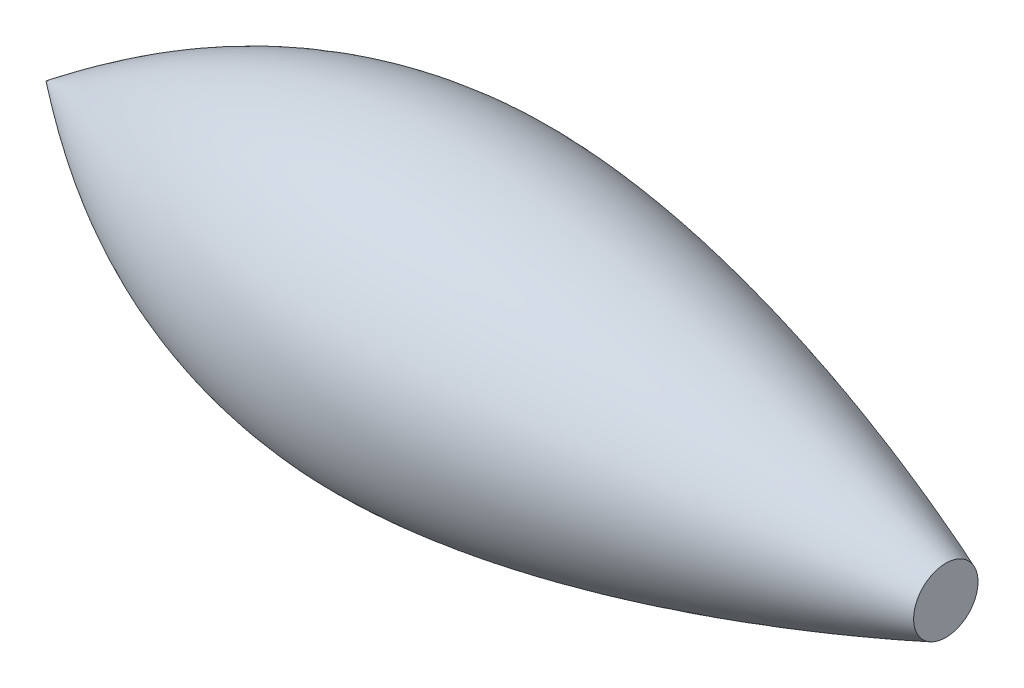
ISO-10303-21;
HEADER;
FILE_DESCRIPTION(('STEP AP214'),'2;1');
FILE_NAME('part.step','',(''),(''),'','','');
FILE_SCHEMA(('AUTOMOTIVE_DESIGN { 1 0 10303 214 1 1 1 1 }'));
ENDSEC;
DATA;
#1=APPLICATION_CONTEXT('core data for automotive mechanical design processes');
#2=APPLICATION_PROTOCOL_DEFINITION('international standard','automotive_design',2000,#1);
#3=PRODUCT_CONTEXT('',#1,'mechanical');
#4=PRODUCT('Part','Part','',(#3));
#5=PRODUCT_RELATED_PRODUCT_CATEGORY('part','',(#4));
#6=PRODUCT_DEFINITION_FORMATION('','',#4);
#7=PRODUCT_DEFINITION_CONTEXT('part definition',#1,'design');
#8=PRODUCT_DEFINITION('design','',#6,#7);
#9=PRODUCT_DEFINITION_SHAPE('','',#8);
#10=(LENGTH_UNIT() NAMED_UNIT(*) SI_UNIT(.MILLI.,.METRE.));
#11=(NAMED_UNIT(*) PLANE_ANGLE_UNIT() SI_UNIT($,.RADIAN.));
#12=(NAMED_UNIT(*) SI_UNIT($,.STERADIAN.) SOLID_ANGLE_UNIT());
#13=UNCERTAINTY_MEASURE_WITH_UNIT(LENGTH_MEASURE(1.E-05),#10,'distance_accuracy_value','');
#14=(GEOMETRIC_REPRESENTATION_CONTEXT(3) GLOBAL_UNCERTAINTY_ASSIGNED_CONTEXT((#13)) GLOBAL_UNIT_ASSIGNED_CONTEXT((#10,
#11,#12)) REPRESENTATION_CONTEXT('',''));
#15=CARTESIAN_POINT('',(0.,0.,0.));
#16=DIRECTION('',(0.,0.,1.));
#17=DIRECTION('',(1.,0.,0.));
#18=AXIS2_PLACEMENT_3D('',#15,#16,#17);
#19=CARTESIAN_POINT('',(4146.60183742536,148.399732449689,0.));
#20=CARTESIAN_POINT('',(3584.92244785807,371.119299512845,0.));
#21=CARTESIAN_POINT('',(1508.1275511773,1052.98842747881,0.));
#22=CARTESIAN_POINT('',(373.603392401501,284.222528442904,0.));
#23=CARTESIAN_POINT('',(0.,0.,0.));
#24=B_SPLINE_CURVE_WITH_KNOTS('',3,(#19,#20,#21,#22,#23),.UNSPECIFIED.,.F.,.F.,(4,1,4),(0.,
0.482891282484943,1.),.UNSPECIFIED.);
#25=CARTESIAN_POINT('',(0.,0.,0.));
#26=DIRECTION('',(-1.,0.,0.));
#27=AXIS1_PLACEMENT('',#25,#26);
#28=SURFACE_OF_REVOLUTION('',#24,#27);
#29=CARTESIAN_POINT('',(0.,0.,0.));
#30=VERTEX_POINT('',#29);
#31=VERTEX_LOOP('',#30);
#32=FACE_BOUND('',#31,.T.);
#33=CARTESIAN_POINT('',(4146.60183742536,0.,0.));
#34=DIRECTION('',(-1.,0.,0.));
#35=DIRECTION('',(0.,0.,1.));
#36=AXIS2_PLACEMENT_3D('',#33,#34,#35);
#37=CIRCLE('',#36,148.399732449689);
#38=CARTESIAN_POINT('',(4146.60183742536,0.,148.399732449689));
#39=VERTEX_POINT('',#38);
#40=EDGE_CURVE('E11',#39,#39,#37,.T.);
#41=ORIENTED_EDGE('',*,*,#40,.T.);
#42=EDGE_LOOP('',(#41));
#43=FACE_BOUND('',#42,.T.);
#44=ADVANCED_FACE('F51',(#32,#43),#28,.T.);
#45=CARTESIAN_POINT('',(4146.60183742536,0.,0.));
#46=DIRECTION('',(-1.,0.,0.));
#47=DIRECTION('',(0.,0.,1.));
#48=AXIS2_PLACEMENT_3D('',#45,#46,#47);
#49=PLANE('',#48);
#50=ORIENTED_EDGE('',*,*,#40,.F.);
#51=EDGE_LOOP('',(#50));
#52=FACE_BOUND('',#51,.T.);
#53=ADVANCED_FACE('F62',(#52),#49,.F.);
#54=CLOSED_SHELL('',(#44,#53));
#55=MANIFOLD_SOLID_BREP('B2',#54);
#56=ADVANCED_BREP_SHAPE_REPRESENTATION('',(#18,#55),#14);
#57=SHAPE_DEFINITION_REPRESENTATION(#9,#56);
ENDSEC;
END-ISO-10303-21;
